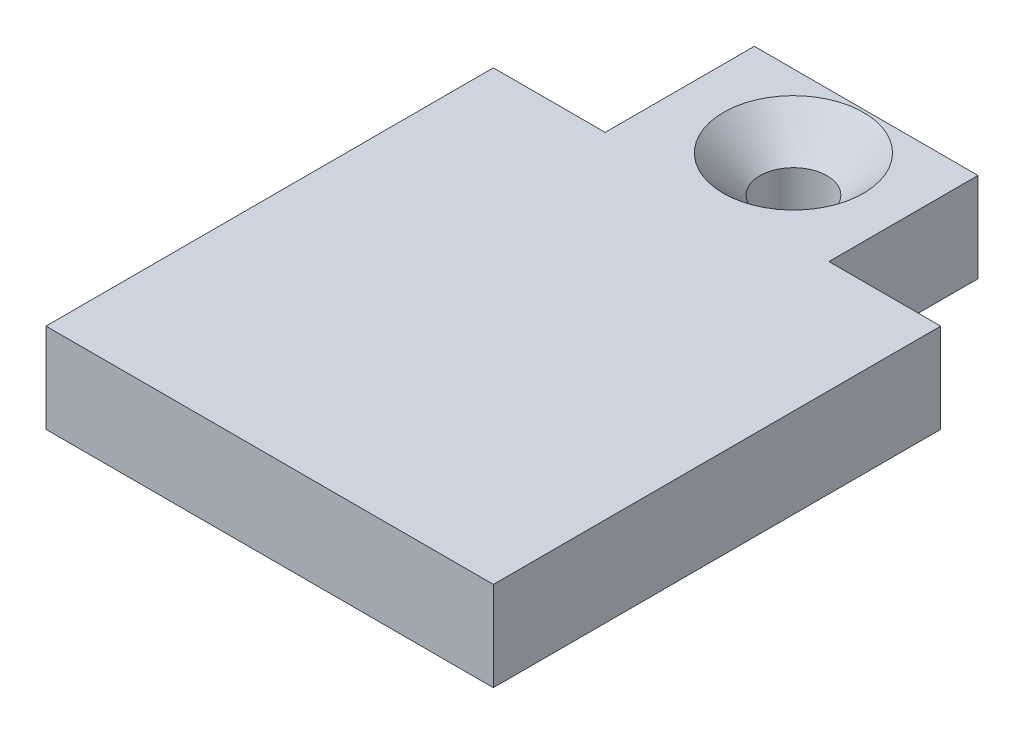
ISO-10303-21;
HEADER;
FILE_DESCRIPTION(('STEP AP214'),'2;1');
FILE_NAME('part.step','',(''),(''),'','','');
FILE_SCHEMA(('AUTOMOTIVE_DESIGN { 1 0 10303 214 1 1 1 1 }'));
ENDSEC;
DATA;
#1=APPLICATION_CONTEXT('core data for automotive mechanical design processes');
#2=APPLICATION_PROTOCOL_DEFINITION('international standard','automotive_design',2000,#1);
#3=PRODUCT_CONTEXT('',#1,'mechanical');
#4=PRODUCT('Part','Part','',(#3));
#5=PRODUCT_RELATED_PRODUCT_CATEGORY('part','',(#4));
#6=PRODUCT_DEFINITION_FORMATION('','',#4);
#7=PRODUCT_DEFINITION_CONTEXT('part definition',#1,'design');
#8=PRODUCT_DEFINITION('design','',#6,#7);
#9=PRODUCT_DEFINITION_SHAPE('','',#8);
#10=(LENGTH_UNIT() NAMED_UNIT(*) SI_UNIT(.MILLI.,.METRE.));
#11=(NAMED_UNIT(*) PLANE_ANGLE_UNIT() SI_UNIT($,.RADIAN.));
#12=(NAMED_UNIT(*) SI_UNIT($,.STERADIAN.) SOLID_ANGLE_UNIT());
#13=UNCERTAINTY_MEASURE_WITH_UNIT(LENGTH_MEASURE(1.E-05),#10,'distance_accuracy_value','');
#14=(GEOMETRIC_REPRESENTATION_CONTEXT(3) GLOBAL_UNCERTAINTY_ASSIGNED_CONTEXT((#13)) GLOBAL_UNIT_ASSIGNED_CONTEXT((#10,
#11,#12)) REPRESENTATION_CONTEXT('',''));
#15=CARTESIAN_POINT('',(0.,0.,0.));
#16=DIRECTION('',(0.,0.,1.));
#17=DIRECTION('',(1.,0.,0.));
#18=AXIS2_PLACEMENT_3D('',#15,#16,#17);
#19=CARTESIAN_POINT('',(-15.,6.,20.));
#20=DIRECTION('',(1.,0.,0.));
#21=DIRECTION('',(0.,0.,-1.));
#22=AXIS2_PLACEMENT_3D('',#19,#20,#21);
#23=PLANE('',#22);
#24=DIRECTION('',(0.,0.,1.));
#25=VECTOR('',#24,1.);
#26=CARTESIAN_POINT('',(-15.,0.,20.));
#27=LINE('',#26,#25);
#28=CARTESIAN_POINT('',(-15.,0.,-10.));
#29=VERTEX_POINT('',#28);
#30=CARTESIAN_POINT('',(-15.,0.,20.));
#31=VERTEX_POINT('',#30);
#32=EDGE_CURVE('E113',#29,#31,#27,.T.);
#33=ORIENTED_EDGE('',*,*,#32,.T.);
#34=DIRECTION('',(0.,-1.,0.));
#35=VECTOR('',#34,1.);
#36=CARTESIAN_POINT('',(-15.,6.,20.));
#37=LINE('',#36,#35);
#38=CARTESIAN_POINT('',(-15.,6.,20.));
#39=VERTEX_POINT('',#38);
#40=EDGE_CURVE('E11',#39,#31,#37,.T.);
#41=ORIENTED_EDGE('',*,*,#40,.F.);
#42=DIRECTION('',(0.,0.,1.));
#43=VECTOR('',#42,1.);
#44=CARTESIAN_POINT('',(-15.,6.,20.));
#45=LINE('',#44,#43);
#46=CARTESIAN_POINT('',(-15.,6.,-10.));
#47=VERTEX_POINT('',#46);
#48=EDGE_CURVE('E128',#47,#39,#45,.T.);
#49=ORIENTED_EDGE('',*,*,#48,.F.);
#50=DIRECTION('',(0.,-1.,0.));
#51=VECTOR('',#50,1.);
#52=CARTESIAN_POINT('',(-15.,6.,-10.));
#53=LINE('',#52,#51);
#54=EDGE_CURVE('E109',#47,#29,#53,.T.);
#55=ORIENTED_EDGE('',*,*,#54,.T.);
#56=EDGE_LOOP('',(#33,#41,#49,#55));
#57=FACE_BOUND('',#56,.T.);
#58=ADVANCED_FACE('F17',(#57),#23,.F.);
#59=CARTESIAN_POINT('',(-15.,6.,20.));
#60=DIRECTION('',(0.,0.,-1.));
#61=DIRECTION('',(-1.,0.,0.));
#62=AXIS2_PLACEMENT_3D('',#59,#60,#61);
#63=PLANE('',#62);
#64=DIRECTION('',(1.,0.,0.));
#65=VECTOR('',#64,1.);
#66=CARTESIAN_POINT('',(-15.,0.,20.));
#67=LINE('',#66,#65);
#68=CARTESIAN_POINT('',(15.,0.,20.));
#69=VERTEX_POINT('',#68);
#70=EDGE_CURVE('E116',#31,#69,#67,.T.);
#71=ORIENTED_EDGE('',*,*,#70,.T.);
#72=DIRECTION('',(0.,-1.,0.));
#73=VECTOR('',#72,1.);
#74=CARTESIAN_POINT('',(15.,6.,20.));
#75=LINE('',#74,#73);
#76=CARTESIAN_POINT('',(15.,6.,20.));
#77=VERTEX_POINT('',#76);
#78=EDGE_CURVE('E25',#77,#69,#75,.T.);
#79=ORIENTED_EDGE('',*,*,#78,.F.);
#80=DIRECTION('',(1.,0.,0.));
#81=VECTOR('',#80,1.);
#82=CARTESIAN_POINT('',(-15.,6.,20.));
#83=LINE('',#82,#81);
#84=EDGE_CURVE('E76',#39,#77,#83,.T.);
#85=ORIENTED_EDGE('',*,*,#84,.F.);
#86=ORIENTED_EDGE('',*,*,#40,.T.);
#87=EDGE_LOOP('',(#71,#79,#85,#86));
#88=FACE_BOUND('',#87,.T.);
#89=ADVANCED_FACE('F187',(#88),#63,.F.);
#90=CARTESIAN_POINT('',(15.,6.,20.));
#91=DIRECTION('',(-1.,0.,0.));
#92=DIRECTION('',(0.,0.,1.));
#93=AXIS2_PLACEMENT_3D('',#90,#91,#92);
#94=PLANE('',#93);
#95=DIRECTION('',(0.,0.,-1.));
#96=VECTOR('',#95,1.);
#97=CARTESIAN_POINT('',(15.,0.,20.));
#98=LINE('',#97,#96);
#99=CARTESIAN_POINT('',(15.,0.,-10.));
#100=VERTEX_POINT('',#99);
#101=EDGE_CURVE('E119',#69,#100,#98,.T.);
#102=ORIENTED_EDGE('',*,*,#101,.T.);
#103=DIRECTION('',(0.,-1.,0.));
#104=VECTOR('',#103,1.);
#105=CARTESIAN_POINT('',(15.,6.,-10.));
#106=LINE('',#105,#104);
#107=CARTESIAN_POINT('',(15.,6.,-10.));
#108=VERTEX_POINT('',#107);
#109=EDGE_CURVE('E135',#108,#100,#106,.T.);
#110=ORIENTED_EDGE('',*,*,#109,.F.);
#111=DIRECTION('',(0.,0.,-1.));
#112=VECTOR('',#111,1.);
#113=CARTESIAN_POINT('',(15.,6.,20.));
#114=LINE('',#113,#112);
#115=EDGE_CURVE('E143',#77,#108,#114,.T.);
#116=ORIENTED_EDGE('',*,*,#115,.F.);
#117=ORIENTED_EDGE('',*,*,#78,.T.);
#118=EDGE_LOOP('',(#102,#110,#116,#117));
#119=FACE_BOUND('',#118,.T.);
#120=ADVANCED_FACE('F141',(#119),#94,.F.);
#121=CARTESIAN_POINT('',(7.5,6.,-10.));
#122=DIRECTION('',(0.,0.,1.));
#123=DIRECTION('',(1.,0.,0.));
#124=AXIS2_PLACEMENT_3D('',#121,#122,#123);
#125=PLANE('',#124);
#126=DIRECTION('',(-1.,0.,0.));
#127=VECTOR('',#126,1.);
#128=CARTESIAN_POINT('',(7.5,0.,-10.));
#129=LINE('',#128,#127);
#130=CARTESIAN_POINT('',(7.5,0.,-10.));
#131=VERTEX_POINT('',#130);
#132=EDGE_CURVE('E121',#100,#131,#129,.T.);
#133=ORIENTED_EDGE('',*,*,#132,.T.);
#134=DIRECTION('',(0.,-1.,0.));
#135=VECTOR('',#134,1.);
#136=CARTESIAN_POINT('',(7.5,6.,-10.));
#137=LINE('',#136,#135);
#138=CARTESIAN_POINT('',(7.5,6.,-10.));
#139=VERTEX_POINT('',#138);
#140=EDGE_CURVE('E132',#139,#131,#137,.T.);
#141=ORIENTED_EDGE('',*,*,#140,.F.);
#142=DIRECTION('',(-1.,0.,0.));
#143=VECTOR('',#142,1.);
#144=CARTESIAN_POINT('',(7.5,6.,-10.));
#145=LINE('',#144,#143);
#146=EDGE_CURVE('E155',#108,#139,#145,.T.);
#147=ORIENTED_EDGE('',*,*,#146,.F.);
#148=ORIENTED_EDGE('',*,*,#109,.T.);
#149=EDGE_LOOP('',(#133,#141,#147,#148));
#150=FACE_BOUND('',#149,.T.);
#151=ADVANCED_FACE('F151',(#150),#125,.F.);
#152=CARTESIAN_POINT('',(7.5,6.,-10.));
#153=DIRECTION('',(-1.,0.,0.));
#154=DIRECTION('',(0.,0.,1.));
#155=AXIS2_PLACEMENT_3D('',#152,#153,#154);
#156=PLANE('',#155);
#157=DIRECTION('',(0.,0.,-1.));
#158=VECTOR('',#157,1.);
#159=CARTESIAN_POINT('',(7.5,0.,-10.));
#160=LINE('',#159,#158);
#161=CARTESIAN_POINT('',(7.5,0.,-20.));
#162=VERTEX_POINT('',#161);
#163=EDGE_CURVE('E123',#131,#162,#160,.T.);
#164=ORIENTED_EDGE('',*,*,#163,.T.);
#165=DIRECTION('',(0.,-1.,0.));
#166=VECTOR('',#165,1.);
#167=CARTESIAN_POINT('',(7.5,6.,-20.));
#168=LINE('',#167,#166);
#169=CARTESIAN_POINT('',(7.5,6.,-20.));
#170=VERTEX_POINT('',#169);
#171=EDGE_CURVE('E104',#170,#162,#168,.T.);
#172=ORIENTED_EDGE('',*,*,#171,.F.);
#173=DIRECTION('',(0.,0.,-1.));
#174=VECTOR('',#173,1.);
#175=CARTESIAN_POINT('',(7.5,6.,-10.));
#176=LINE('',#175,#174);
#177=EDGE_CURVE('E95',#139,#170,#176,.T.);
#178=ORIENTED_EDGE('',*,*,#177,.F.);
#179=ORIENTED_EDGE('',*,*,#140,.T.);
#180=EDGE_LOOP('',(#164,#172,#178,#179));
#181=FACE_BOUND('',#180,.T.);
#182=ADVANCED_FACE('F154',(#181),#156,.F.);
#183=CARTESIAN_POINT('',(-7.5,6.,-20.));
#184=DIRECTION('',(0.,0.,1.));
#185=DIRECTION('',(1.,0.,0.));
#186=AXIS2_PLACEMENT_3D('',#183,#184,#185);
#187=PLANE('',#186);
#188=DIRECTION('',(-1.,0.,0.));
#189=VECTOR('',#188,1.);
#190=CARTESIAN_POINT('',(-7.5,0.,-20.));
#191=LINE('',#190,#189);
#192=CARTESIAN_POINT('',(-7.5,0.,-20.));
#193=VERTEX_POINT('',#192);
#194=EDGE_CURVE('E103',#162,#193,#191,.T.);
#195=ORIENTED_EDGE('',*,*,#194,.T.);
#196=DIRECTION('',(0.,-1.,0.));
#197=VECTOR('',#196,1.);
#198=CARTESIAN_POINT('',(-7.5,6.,-20.));
#199=LINE('',#198,#197);
#200=CARTESIAN_POINT('',(-7.5,6.,-20.));
#201=VERTEX_POINT('',#200);
#202=EDGE_CURVE('E100',#201,#193,#199,.T.);
#203=ORIENTED_EDGE('',*,*,#202,.F.);
#204=DIRECTION('',(-1.,0.,0.));
#205=VECTOR('',#204,1.);
#206=CARTESIAN_POINT('',(-7.5,6.,-20.));
#207=LINE('',#206,#205);
#208=EDGE_CURVE('E89',#170,#201,#207,.T.);
#209=ORIENTED_EDGE('',*,*,#208,.F.);
#210=ORIENTED_EDGE('',*,*,#171,.T.);
#211=EDGE_LOOP('',(#195,#203,#209,#210));
#212=FACE_BOUND('',#211,.T.);
#213=ADVANCED_FACE('F101',(#212),#187,.F.);
#214=CARTESIAN_POINT('',(-7.5,6.,-20.));
#215=DIRECTION('',(1.,0.,0.));
#216=DIRECTION('',(0.,0.,-1.));
#217=AXIS2_PLACEMENT_3D('',#214,#215,#216);
#218=PLANE('',#217);
#219=DIRECTION('',(0.,0.,1.));
#220=VECTOR('',#219,1.);
#221=CARTESIAN_POINT('',(-7.5,0.,-20.));
#222=LINE('',#221,#220);
#223=CARTESIAN_POINT('',(-7.5,0.,-10.));
#224=VERTEX_POINT('',#223);
#225=EDGE_CURVE('E62',#193,#224,#222,.T.);
#226=ORIENTED_EDGE('',*,*,#225,.T.);
#227=DIRECTION('',(0.,-1.,0.));
#228=VECTOR('',#227,1.);
#229=CARTESIAN_POINT('',(-7.5,6.,-10.));
#230=LINE('',#229,#228);
#231=CARTESIAN_POINT('',(-7.5,6.,-10.));
#232=VERTEX_POINT('',#231);
#233=EDGE_CURVE('E105',#232,#224,#230,.T.);
#234=ORIENTED_EDGE('',*,*,#233,.F.);
#235=DIRECTION('',(0.,0.,1.));
#236=VECTOR('',#235,1.);
#237=CARTESIAN_POINT('',(-7.5,6.,-20.));
#238=LINE('',#237,#236);
#239=EDGE_CURVE('E93',#201,#232,#238,.T.);
#240=ORIENTED_EDGE('',*,*,#239,.F.);
#241=ORIENTED_EDGE('',*,*,#202,.T.);
#242=EDGE_LOOP('',(#226,#234,#240,#241));
#243=FACE_BOUND('',#242,.T.);
#244=ADVANCED_FACE('F107',(#243),#218,.F.);
#245=CARTESIAN_POINT('',(-7.5,6.,-10.));
#246=DIRECTION('',(0.,0.,1.));
#247=DIRECTION('',(1.,0.,0.));
#248=AXIS2_PLACEMENT_3D('',#245,#246,#247);
#249=PLANE('',#248);
#250=DIRECTION('',(-1.,0.,0.));
#251=VECTOR('',#250,1.);
#252=CARTESIAN_POINT('',(-7.5,0.,-10.));
#253=LINE('',#252,#251);
#254=EDGE_CURVE('E68',#224,#29,#253,.T.);
#255=ORIENTED_EDGE('',*,*,#254,.T.);
#256=ORIENTED_EDGE('',*,*,#54,.F.);
#257=DIRECTION('',(-1.,0.,0.));
#258=VECTOR('',#257,1.);
#259=CARTESIAN_POINT('',(-7.5,6.,-10.));
#260=LINE('',#259,#258);
#261=EDGE_CURVE('E33',#232,#47,#260,.T.);
#262=ORIENTED_EDGE('',*,*,#261,.F.);
#263=ORIENTED_EDGE('',*,*,#233,.T.);
#264=EDGE_LOOP('',(#255,#256,#262,#263));
#265=FACE_BOUND('',#264,.T.);
#266=ADVANCED_FACE('F173',(#265),#249,.F.);
#267=CARTESIAN_POINT('',(-15.,6.,-10.));
#268=DIRECTION('',(0.,1.,0.));
#269=DIRECTION('',(0.,0.,1.));
#270=AXIS2_PLACEMENT_3D('',#267,#268,#269);
#271=PLANE('',#270);
#272=CARTESIAN_POINT('',(0.,6.,-15.1233549324485));
#273=DIRECTION('',(0.,1.,0.));
#274=DIRECTION('',(0.,0.,1.));
#275=AXIS2_PLACEMENT_3D('',#272,#273,#274);
#276=CIRCLE('',#275,4.7);
#277=CARTESIAN_POINT('',(0.,6.,-10.4233549324485));
#278=VERTEX_POINT('',#277);
#279=EDGE_CURVE('E166',#278,#278,#276,.T.);
#280=ORIENTED_EDGE('',*,*,#279,.F.);
#281=EDGE_LOOP('',(#280));
#282=FACE_BOUND('',#281,.T.);
#283=ORIENTED_EDGE('',*,*,#48,.T.);
#284=ORIENTED_EDGE('',*,*,#84,.T.);
#285=ORIENTED_EDGE('',*,*,#115,.T.);
#286=ORIENTED_EDGE('',*,*,#146,.T.);
#287=ORIENTED_EDGE('',*,*,#177,.T.);
#288=ORIENTED_EDGE('',*,*,#208,.T.);
#289=ORIENTED_EDGE('',*,*,#239,.T.);
#290=ORIENTED_EDGE('',*,*,#261,.T.);
#291=EDGE_LOOP('',(#283,#284,#285,#286,#287,#288,#289,#290));
#292=FACE_BOUND('',#291,.T.);
#293=ADVANCED_FACE('F91',(#282,#292),#271,.T.);
#294=CARTESIAN_POINT('',(-15.,0.,-10.));
#295=DIRECTION('',(0.,1.,0.));
#296=DIRECTION('',(0.,0.,1.));
#297=AXIS2_PLACEMENT_3D('',#294,#295,#296);
#298=PLANE('',#297);
#299=CARTESIAN_POINT('',(0.,0.,-15.1233549324485));
#300=DIRECTION('',(0.,1.,0.));
#301=DIRECTION('',(0.,0.,1.));
#302=AXIS2_PLACEMENT_3D('',#299,#300,#301);
#303=CIRCLE('',#302,2.25);
#304=CARTESIAN_POINT('',(0.,0.,-12.8733549324485));
#305=VERTEX_POINT('',#304);
#306=EDGE_CURVE('E117',#305,#305,#303,.T.);
#307=ORIENTED_EDGE('',*,*,#306,.T.);
#308=EDGE_LOOP('',(#307));
#309=FACE_BOUND('',#308,.T.);
#310=ORIENTED_EDGE('',*,*,#32,.F.);
#311=ORIENTED_EDGE('',*,*,#254,.F.);
#312=ORIENTED_EDGE('',*,*,#225,.F.);
#313=ORIENTED_EDGE('',*,*,#194,.F.);
#314=ORIENTED_EDGE('',*,*,#163,.F.);
#315=ORIENTED_EDGE('',*,*,#132,.F.);
#316=ORIENTED_EDGE('',*,*,#101,.F.);
#317=ORIENTED_EDGE('',*,*,#70,.F.);
#318=EDGE_LOOP('',(#310,#311,#312,#313,#314,#315,#316,#317));
#319=FACE_BOUND('',#318,.T.);
#320=ADVANCED_FACE('F147',(#309,#319),#298,.F.);
#321=CARTESIAN_POINT('',(0.,6.,-15.1233549324485));
#322=DIRECTION('',(0.,1.,0.));
#323=DIRECTION('',(0.,0.,1.));
#324=AXIS2_PLACEMENT_3D('',#321,#322,#323);
#325=CYLINDRICAL_SURFACE('',#324,2.25);
#326=ORIENTED_EDGE('',*,*,#306,.F.);
#327=EDGE_LOOP('',(#326));
#328=FACE_BOUND('',#327,.T.);
#329=CARTESIAN_POINT('',(0.,3.55,-15.1233549324485));
#330=DIRECTION('',(0.,1.,0.));
#331=DIRECTION('',(0.,0.,1.));
#332=AXIS2_PLACEMENT_3D('',#329,#330,#331);
#333=CIRCLE('',#332,2.25);
#334=CARTESIAN_POINT('',(0.,3.55,-12.8733549324485));
#335=VERTEX_POINT('',#334);
#336=EDGE_CURVE('E163',#335,#335,#333,.T.);
#337=ORIENTED_EDGE('',*,*,#336,.T.);
#338=EDGE_LOOP('',(#337));
#339=FACE_BOUND('',#338,.T.);
#340=ADVANCED_FACE('F181',(#328,#339),#325,.F.);
#341=CARTESIAN_POINT('',(0.,6.,-15.1233549324485));
#342=DIRECTION('',(0.,1.,0.));
#343=DIRECTION('',(0.,0.,1.));
#344=AXIS2_PLACEMENT_3D('',#341,#342,#343);
#345=CONICAL_SURFACE('',#344,4.7,0.785398163397449);
#346=ORIENTED_EDGE('',*,*,#336,.F.);
#347=EDGE_LOOP('',(#346));
#348=FACE_BOUND('',#347,.T.);
#349=ORIENTED_EDGE('',*,*,#279,.T.);
#350=EDGE_LOOP('',(#349));
#351=FACE_BOUND('',#350,.T.);
#352=ADVANCED_FACE('F170',(#348,#351),#345,.F.);
#353=CLOSED_SHELL('',(#58,#89,#120,#151,#182,#213,#244,#266,#293,#320,#340,#352));
#354=MANIFOLD_SOLID_BREP('B1',#353);
#355=ADVANCED_BREP_SHAPE_REPRESENTATION('',(#18,#354),#14);
#356=SHAPE_DEFINITION_REPRESENTATION(#9,#355);
ENDSEC;
END-ISO-10303-21;
